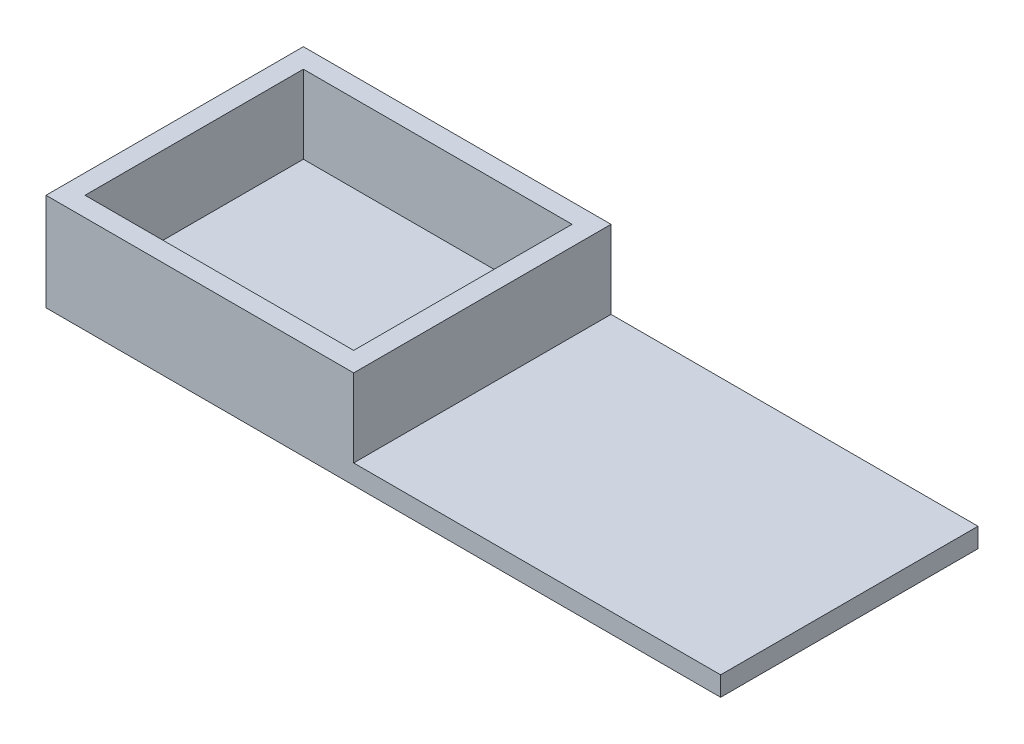
ISO-10303-21;
HEADER;
FILE_DESCRIPTION(('STEP AP214'),'2;1');
FILE_NAME('part.step','',(''),(''),'','','');
FILE_SCHEMA(('AUTOMOTIVE_DESIGN { 1 0 10303 214 1 1 1 1 }'));
ENDSEC;
DATA;
#1=APPLICATION_CONTEXT('core data for automotive mechanical design processes');
#2=APPLICATION_PROTOCOL_DEFINITION('international standard','automotive_design',2000,#1);
#3=PRODUCT_CONTEXT('',#1,'mechanical');
#4=PRODUCT('Part','Part','',(#3));
#5=PRODUCT_RELATED_PRODUCT_CATEGORY('part','',(#4));
#6=PRODUCT_DEFINITION_FORMATION('','',#4);
#7=PRODUCT_DEFINITION_CONTEXT('part definition',#1,'design');
#8=PRODUCT_DEFINITION('design','',#6,#7);
#9=PRODUCT_DEFINITION_SHAPE('','',#8);
#10=(LENGTH_UNIT() NAMED_UNIT(*) SI_UNIT(.MILLI.,.METRE.));
#11=(NAMED_UNIT(*) PLANE_ANGLE_UNIT() SI_UNIT($,.RADIAN.));
#12=(NAMED_UNIT(*) SI_UNIT($,.STERADIAN.) SOLID_ANGLE_UNIT());
#13=UNCERTAINTY_MEASURE_WITH_UNIT(LENGTH_MEASURE(1.E-05),#10,'distance_accuracy_value','');
#14=(GEOMETRIC_REPRESENTATION_CONTEXT(3) GLOBAL_UNCERTAINTY_ASSIGNED_CONTEXT((#13)) GLOBAL_UNIT_ASSIGNED_CONTEXT((#10,
#11,#12)) REPRESENTATION_CONTEXT('',''));
#15=CARTESIAN_POINT('',(0.,0.,0.));
#16=DIRECTION('',(0.,0.,1.));
#17=DIRECTION('',(1.,0.,0.));
#18=AXIS2_PLACEMENT_3D('',#15,#16,#17);
#19=CARTESIAN_POINT('',(0.,5.,33.));
#20=DIRECTION('',(0.,0.,-1.));
#21=DIRECTION('',(-1.,0.,0.));
#22=AXIS2_PLACEMENT_3D('',#19,#20,#21);
#23=PLANE('',#22);
#24=DIRECTION('',(1.,0.,0.));
#25=VECTOR('',#24,1.);
#26=CARTESIAN_POINT('',(0.,0.,33.));
#27=LINE('',#26,#25);
#28=CARTESIAN_POINT('',(-86.5,0.,33.));
#29=VERTEX_POINT('',#28);
#30=CARTESIAN_POINT('',(86.5,0.,33.));
#31=VERTEX_POINT('',#30);
#32=EDGE_CURVE('E166',#29,#31,#27,.T.);
#33=ORIENTED_EDGE('',*,*,#32,.T.);
#34=DIRECTION('',(0.,-1.,0.));
#35=VECTOR('',#34,1.);
#36=CARTESIAN_POINT('',(86.5,5.,33.));
#37=LINE('',#36,#35);
#38=CARTESIAN_POINT('',(86.5,5.,33.));
#39=VERTEX_POINT('',#38);
#40=EDGE_CURVE('E11',#39,#31,#37,.T.);
#41=ORIENTED_EDGE('',*,*,#40,.F.);
#42=DIRECTION('',(1.,0.,0.));
#43=VECTOR('',#42,1.);
#44=CARTESIAN_POINT('',(0.,5.,33.));
#45=LINE('',#44,#43);
#46=CARTESIAN_POINT('',(-7.59999999999994,5.,33.));
#47=VERTEX_POINT('',#46);
#48=EDGE_CURVE('E167',#47,#39,#45,.T.);
#49=ORIENTED_EDGE('',*,*,#48,.F.);
#50=DIRECTION('',(0.,-1.,0.));
#51=VECTOR('',#50,1.);
#52=CARTESIAN_POINT('',(-7.59999999999994,25.,33.));
#53=LINE('',#52,#51);
#54=CARTESIAN_POINT('',(-7.59999999999994,25.,33.));
#55=VERTEX_POINT('',#54);
#56=EDGE_CURVE('E163',#55,#47,#53,.T.);
#57=ORIENTED_EDGE('',*,*,#56,.F.);
#58=DIRECTION('',(1.,0.,0.));
#59=VECTOR('',#58,1.);
#60=CARTESIAN_POINT('',(-7.59999999999994,25.,33.));
#61=LINE('',#60,#59);
#62=CARTESIAN_POINT('',(-86.5,25.,33.));
#63=VERTEX_POINT('',#62);
#64=EDGE_CURVE('E152',#63,#55,#61,.T.);
#65=ORIENTED_EDGE('',*,*,#64,.F.);
#66=DIRECTION('',(0.,-1.,0.));
#67=VECTOR('',#66,1.);
#68=CARTESIAN_POINT('',(-86.5,5.,33.));
#69=LINE('',#68,#67);
#70=EDGE_CURVE('E175',#63,#29,#69,.T.);
#71=ORIENTED_EDGE('',*,*,#70,.T.);
#72=EDGE_LOOP('',(#33,#41,#49,#57,#65,#71));
#73=FACE_BOUND('',#72,.T.);
#74=ADVANCED_FACE('F35',(#73),#23,.F.);
#75=CARTESIAN_POINT('',(86.5,5.,0.));
#76=DIRECTION('',(-1.,0.,0.));
#77=DIRECTION('',(0.,0.,1.));
#78=AXIS2_PLACEMENT_3D('',#75,#76,#77);
#79=PLANE('',#78);
#80=DIRECTION('',(0.,0.,-1.));
#81=VECTOR('',#80,1.);
#82=CARTESIAN_POINT('',(86.5,0.,0.));
#83=LINE('',#82,#81);
#84=CARTESIAN_POINT('',(86.5,0.,-33.));
#85=VERTEX_POINT('',#84);
#86=EDGE_CURVE('E178',#31,#85,#83,.T.);
#87=ORIENTED_EDGE('',*,*,#86,.T.);
#88=DIRECTION('',(0.,-1.,0.));
#89=VECTOR('',#88,1.);
#90=CARTESIAN_POINT('',(86.5,5.,-33.));
#91=LINE('',#90,#89);
#92=CARTESIAN_POINT('',(86.5,5.,-33.));
#93=VERTEX_POINT('',#92);
#94=EDGE_CURVE('E42',#93,#85,#91,.T.);
#95=ORIENTED_EDGE('',*,*,#94,.F.);
#96=DIRECTION('',(0.,0.,-1.));
#97=VECTOR('',#96,1.);
#98=CARTESIAN_POINT('',(86.5,5.,0.));
#99=LINE('',#98,#97);
#100=EDGE_CURVE('E169',#39,#93,#99,.T.);
#101=ORIENTED_EDGE('',*,*,#100,.F.);
#102=ORIENTED_EDGE('',*,*,#40,.T.);
#103=EDGE_LOOP('',(#87,#95,#101,#102));
#104=FACE_BOUND('',#103,.T.);
#105=ADVANCED_FACE('F194',(#104),#79,.F.);
#106=CARTESIAN_POINT('',(0.,5.,-33.));
#107=DIRECTION('',(0.,0.,-1.));
#108=DIRECTION('',(-1.,0.,0.));
#109=AXIS2_PLACEMENT_3D('',#106,#107,#108);
#110=PLANE('',#109);
#111=DIRECTION('',(1.,0.,0.));
#112=VECTOR('',#111,1.);
#113=CARTESIAN_POINT('',(0.,0.,-33.));
#114=LINE('',#113,#112);
#115=CARTESIAN_POINT('',(-86.5,0.,-33.));
#116=VERTEX_POINT('',#115);
#117=EDGE_CURVE('E181',#116,#85,#114,.T.);
#118=ORIENTED_EDGE('',*,*,#117,.F.);
#119=DIRECTION('',(0.,-1.,0.));
#120=VECTOR('',#119,1.);
#121=CARTESIAN_POINT('',(-86.5,5.,-33.));
#122=LINE('',#121,#120);
#123=CARTESIAN_POINT('',(-86.5,25.,-33.));
#124=VERTEX_POINT('',#123);
#125=EDGE_CURVE('E187',#124,#116,#122,.T.);
#126=ORIENTED_EDGE('',*,*,#125,.F.);
#127=DIRECTION('',(-1.,0.,0.));
#128=VECTOR('',#127,1.);
#129=CARTESIAN_POINT('',(-7.59999999999994,25.,-33.));
#130=LINE('',#129,#128);
#131=CARTESIAN_POINT('',(-7.59999999999994,25.,-33.));
#132=VERTEX_POINT('',#131);
#133=EDGE_CURVE('E156',#132,#124,#130,.T.);
#134=ORIENTED_EDGE('',*,*,#133,.F.);
#135=DIRECTION('',(0.,-1.,0.));
#136=VECTOR('',#135,1.);
#137=CARTESIAN_POINT('',(-7.59999999999994,25.,-33.));
#138=LINE('',#137,#136);
#139=CARTESIAN_POINT('',(-7.59999999999994,5.,-33.));
#140=VERTEX_POINT('',#139);
#141=EDGE_CURVE('E159',#132,#140,#138,.T.);
#142=ORIENTED_EDGE('',*,*,#141,.T.);
#143=DIRECTION('',(1.,0.,0.));
#144=VECTOR('',#143,1.);
#145=CARTESIAN_POINT('',(0.,5.,-33.));
#146=LINE('',#145,#144);
#147=EDGE_CURVE('E173',#140,#93,#146,.T.);
#148=ORIENTED_EDGE('',*,*,#147,.T.);
#149=ORIENTED_EDGE('',*,*,#94,.T.);
#150=EDGE_LOOP('',(#118,#126,#134,#142,#148,#149));
#151=FACE_BOUND('',#150,.T.);
#152=ADVANCED_FACE('F191',(#151),#110,.T.);
#153=CARTESIAN_POINT('',(-86.5,5.,0.));
#154=DIRECTION('',(-1.,0.,0.));
#155=DIRECTION('',(0.,0.,1.));
#156=AXIS2_PLACEMENT_3D('',#153,#154,#155);
#157=PLANE('',#156);
#158=DIRECTION('',(0.,0.,-1.));
#159=VECTOR('',#158,1.);
#160=CARTESIAN_POINT('',(-86.5,0.,0.));
#161=LINE('',#160,#159);
#162=EDGE_CURVE('E170',#29,#116,#161,.T.);
#163=ORIENTED_EDGE('',*,*,#162,.F.);
#164=ORIENTED_EDGE('',*,*,#70,.F.);
#165=DIRECTION('',(0.,0.,1.));
#166=VECTOR('',#165,1.);
#167=CARTESIAN_POINT('',(-86.5,25.,33.));
#168=LINE('',#167,#166);
#169=EDGE_CURVE('E149',#124,#63,#168,.T.);
#170=ORIENTED_EDGE('',*,*,#169,.F.);
#171=ORIENTED_EDGE('',*,*,#125,.T.);
#172=EDGE_LOOP('',(#163,#164,#170,#171));
#173=FACE_BOUND('',#172,.T.);
#174=ADVANCED_FACE('F201',(#173),#157,.T.);
#175=CARTESIAN_POINT('',(0.,5.,0.));
#176=DIRECTION('',(0.,1.,0.));
#177=DIRECTION('',(0.,0.,1.));
#178=AXIS2_PLACEMENT_3D('',#175,#176,#177);
#179=PLANE('',#178);
#180=DIRECTION('',(0.,0.,-1.));
#181=VECTOR('',#180,1.);
#182=CARTESIAN_POINT('',(-7.59999999999994,5.,33.));
#183=LINE('',#182,#181);
#184=EDGE_CURVE('E57',#47,#140,#183,.T.);
#185=ORIENTED_EDGE('',*,*,#184,.F.);
#186=ORIENTED_EDGE('',*,*,#48,.T.);
#187=ORIENTED_EDGE('',*,*,#100,.T.);
#188=ORIENTED_EDGE('',*,*,#147,.F.);
#189=EDGE_LOOP('',(#185,#186,#187,#188));
#190=FACE_BOUND('',#189,.T.);
#191=ADVANCED_FACE('F213',(#190),#179,.T.);
#192=CARTESIAN_POINT('',(0.,0.,0.));
#193=DIRECTION('',(0.,1.,0.));
#194=DIRECTION('',(0.,0.,1.));
#195=AXIS2_PLACEMENT_3D('',#192,#193,#194);
#196=PLANE('',#195);
#197=ORIENTED_EDGE('',*,*,#32,.F.);
#198=ORIENTED_EDGE('',*,*,#162,.T.);
#199=ORIENTED_EDGE('',*,*,#117,.T.);
#200=ORIENTED_EDGE('',*,*,#86,.F.);
#201=EDGE_LOOP('',(#197,#198,#199,#200));
#202=FACE_BOUND('',#201,.T.);
#203=ADVANCED_FACE('F198',(#202),#196,.F.);
#204=CARTESIAN_POINT('',(-7.59999999999994,25.,33.));
#205=DIRECTION('',(-1.,0.,0.));
#206=DIRECTION('',(0.,0.,1.));
#207=AXIS2_PLACEMENT_3D('',#204,#205,#206);
#208=PLANE('',#207);
#209=ORIENTED_EDGE('',*,*,#184,.T.);
#210=ORIENTED_EDGE('',*,*,#141,.F.);
#211=DIRECTION('',(0.,0.,-1.));
#212=VECTOR('',#211,1.);
#213=CARTESIAN_POINT('',(-7.59999999999994,25.,33.));
#214=LINE('',#213,#212);
#215=EDGE_CURVE('E154',#55,#132,#214,.T.);
#216=ORIENTED_EDGE('',*,*,#215,.F.);
#217=ORIENTED_EDGE('',*,*,#56,.T.);
#218=EDGE_LOOP('',(#209,#210,#216,#217));
#219=FACE_BOUND('',#218,.T.);
#220=ADVANCED_FACE('F211',(#219),#208,.F.);
#221=CARTESIAN_POINT('',(0.,25.,0.));
#222=DIRECTION('',(0.,1.,0.));
#223=DIRECTION('',(0.,0.,1.));
#224=AXIS2_PLACEMENT_3D('',#221,#222,#223);
#225=PLANE('',#224);
#226=DIRECTION('',(0.,0.,1.));
#227=VECTOR('',#226,1.);
#228=CARTESIAN_POINT('',(-81.4999999999999,25.,0.));
#229=LINE('',#228,#227);
#230=CARTESIAN_POINT('',(-81.4999999999999,25.,-28.));
#231=VERTEX_POINT('',#230);
#232=CARTESIAN_POINT('',(-81.4999999999999,25.,28.));
#233=VERTEX_POINT('',#232);
#234=EDGE_CURVE('E119',#231,#233,#229,.T.);
#235=ORIENTED_EDGE('',*,*,#234,.F.);
#236=DIRECTION('',(-1.,0.,0.));
#237=VECTOR('',#236,1.);
#238=CARTESIAN_POINT('',(0.,25.,-28.));
#239=LINE('',#238,#237);
#240=CARTESIAN_POINT('',(-12.5999999999999,25.,-28.));
#241=VERTEX_POINT('',#240);
#242=EDGE_CURVE('E144',#241,#231,#239,.T.);
#243=ORIENTED_EDGE('',*,*,#242,.F.);
#244=DIRECTION('',(0.,0.,-1.));
#245=VECTOR('',#244,1.);
#246=CARTESIAN_POINT('',(-12.5999999999999,25.,33.));
#247=LINE('',#246,#245);
#248=CARTESIAN_POINT('',(-12.5999999999999,25.,28.));
#249=VERTEX_POINT('',#248);
#250=EDGE_CURVE('E142',#249,#241,#247,.T.);
#251=ORIENTED_EDGE('',*,*,#250,.F.);
#252=DIRECTION('',(1.,0.,0.));
#253=VECTOR('',#252,1.);
#254=CARTESIAN_POINT('',(0.,25.,28.));
#255=LINE('',#254,#253);
#256=EDGE_CURVE('E140',#233,#249,#255,.T.);
#257=ORIENTED_EDGE('',*,*,#256,.F.);
#258=EDGE_LOOP('',(#235,#243,#251,#257));
#259=FACE_BOUND('',#258,.T.);
#260=ORIENTED_EDGE('',*,*,#169,.T.);
#261=ORIENTED_EDGE('',*,*,#64,.T.);
#262=ORIENTED_EDGE('',*,*,#215,.T.);
#263=ORIENTED_EDGE('',*,*,#133,.T.);
#264=EDGE_LOOP('',(#260,#261,#262,#263));
#265=FACE_BOUND('',#264,.T.);
#266=ADVANCED_FACE('F206',(#259,#265),#225,.T.);
#267=CARTESIAN_POINT('',(0.,5.,28.));
#268=DIRECTION('',(0.,0.,-1.));
#269=DIRECTION('',(-1.,0.,0.));
#270=AXIS2_PLACEMENT_3D('',#267,#268,#269);
#271=PLANE('',#270);
#272=DIRECTION('',(1.,0.,0.));
#273=VECTOR('',#272,1.);
#274=CARTESIAN_POINT('',(0.,5.,28.));
#275=LINE('',#274,#273);
#276=CARTESIAN_POINT('',(-81.4999999999999,5.,28.));
#277=VERTEX_POINT('',#276);
#278=CARTESIAN_POINT('',(-12.5999999999999,5.,28.));
#279=VERTEX_POINT('',#278);
#280=EDGE_CURVE('E127',#277,#279,#275,.T.);
#281=ORIENTED_EDGE('',*,*,#280,.F.);
#282=DIRECTION('',(0.,-1.,0.));
#283=VECTOR('',#282,1.);
#284=CARTESIAN_POINT('',(-81.4999999999999,5.,28.));
#285=LINE('',#284,#283);
#286=EDGE_CURVE('E113',#233,#277,#285,.T.);
#287=ORIENTED_EDGE('',*,*,#286,.F.);
#288=ORIENTED_EDGE('',*,*,#256,.T.);
#289=DIRECTION('',(0.,-1.,0.));
#290=VECTOR('',#289,1.);
#291=CARTESIAN_POINT('',(-12.5999999999999,25.,28.));
#292=LINE('',#291,#290);
#293=EDGE_CURVE('E129',#249,#279,#292,.T.);
#294=ORIENTED_EDGE('',*,*,#293,.T.);
#295=EDGE_LOOP('',(#281,#287,#288,#294));
#296=FACE_BOUND('',#295,.T.);
#297=ADVANCED_FACE('F128',(#296),#271,.T.);
#298=CARTESIAN_POINT('',(0.,5.,-28.));
#299=DIRECTION('',(0.,0.,-1.));
#300=DIRECTION('',(-1.,0.,0.));
#301=AXIS2_PLACEMENT_3D('',#298,#299,#300);
#302=PLANE('',#301);
#303=DIRECTION('',(0.,-1.,0.));
#304=VECTOR('',#303,1.);
#305=CARTESIAN_POINT('',(-12.5999999999999,25.,-28.));
#306=LINE('',#305,#304);
#307=CARTESIAN_POINT('',(-12.5999999999999,5.,-28.));
#308=VERTEX_POINT('',#307);
#309=EDGE_CURVE('E49',#241,#308,#306,.T.);
#310=ORIENTED_EDGE('',*,*,#309,.F.);
#311=ORIENTED_EDGE('',*,*,#242,.T.);
#312=DIRECTION('',(0.,-1.,0.));
#313=VECTOR('',#312,1.);
#314=CARTESIAN_POINT('',(-81.4999999999999,5.,-28.));
#315=LINE('',#314,#313);
#316=CARTESIAN_POINT('',(-81.4999999999999,5.,-28.));
#317=VERTEX_POINT('',#316);
#318=EDGE_CURVE('E123',#231,#317,#315,.T.);
#319=ORIENTED_EDGE('',*,*,#318,.T.);
#320=DIRECTION('',(1.,0.,0.));
#321=VECTOR('',#320,1.);
#322=CARTESIAN_POINT('',(0.,5.,-28.));
#323=LINE('',#322,#321);
#324=EDGE_CURVE('E131',#317,#308,#323,.T.);
#325=ORIENTED_EDGE('',*,*,#324,.T.);
#326=EDGE_LOOP('',(#310,#311,#319,#325));
#327=FACE_BOUND('',#326,.T.);
#328=ADVANCED_FACE('F270',(#327),#302,.F.);
#329=CARTESIAN_POINT('',(-81.4999999999999,5.,0.));
#330=DIRECTION('',(-1.,0.,0.));
#331=DIRECTION('',(0.,0.,1.));
#332=AXIS2_PLACEMENT_3D('',#329,#330,#331);
#333=PLANE('',#332);
#334=DIRECTION('',(0.,0.,-1.));
#335=VECTOR('',#334,1.);
#336=CARTESIAN_POINT('',(-81.4999999999999,5.,0.));
#337=LINE('',#336,#335);
#338=EDGE_CURVE('E117',#277,#317,#337,.T.);
#339=ORIENTED_EDGE('',*,*,#338,.T.);
#340=ORIENTED_EDGE('',*,*,#318,.F.);
#341=ORIENTED_EDGE('',*,*,#234,.T.);
#342=ORIENTED_EDGE('',*,*,#286,.T.);
#343=EDGE_LOOP('',(#339,#340,#341,#342));
#344=FACE_BOUND('',#343,.T.);
#345=ADVANCED_FACE('F115',(#344),#333,.F.);
#346=CARTESIAN_POINT('',(0.,5.,0.));
#347=DIRECTION('',(0.,1.,0.));
#348=DIRECTION('',(0.,0.,1.));
#349=AXIS2_PLACEMENT_3D('',#346,#347,#348);
#350=PLANE('',#349);
#351=ORIENTED_EDGE('',*,*,#324,.F.);
#352=ORIENTED_EDGE('',*,*,#338,.F.);
#353=ORIENTED_EDGE('',*,*,#280,.T.);
#354=DIRECTION('',(0.,0.,1.));
#355=VECTOR('',#354,1.);
#356=CARTESIAN_POINT('',(-12.5999999999999,5.,0.));
#357=LINE('',#356,#355);
#358=EDGE_CURVE('E147',#308,#279,#357,.T.);
#359=ORIENTED_EDGE('',*,*,#358,.F.);
#360=EDGE_LOOP('',(#351,#352,#353,#359));
#361=FACE_BOUND('',#360,.T.);
#362=ADVANCED_FACE('F133',(#361),#350,.T.);
#363=CARTESIAN_POINT('',(-12.5999999999999,25.,33.));
#364=DIRECTION('',(-1.,0.,0.));
#365=DIRECTION('',(0.,0.,1.));
#366=AXIS2_PLACEMENT_3D('',#363,#364,#365);
#367=PLANE('',#366);
#368=ORIENTED_EDGE('',*,*,#358,.T.);
#369=ORIENTED_EDGE('',*,*,#293,.F.);
#370=ORIENTED_EDGE('',*,*,#250,.T.);
#371=ORIENTED_EDGE('',*,*,#309,.T.);
#372=EDGE_LOOP('',(#368,#369,#370,#371));
#373=FACE_BOUND('',#372,.T.);
#374=ADVANCED_FACE('F298',(#373),#367,.T.);
#375=CLOSED_SHELL('',(#74,#105,#152,#174,#191,#203,#220,#266,#297,#328,#345,#362,#374));
#376=MANIFOLD_SOLID_BREP('B2',#375);
#377=ADVANCED_BREP_SHAPE_REPRESENTATION('',(#18,#376),#14);
#378=SHAPE_DEFINITION_REPRESENTATION(#9,#377);
ENDSEC;
END-ISO-10303-21;
